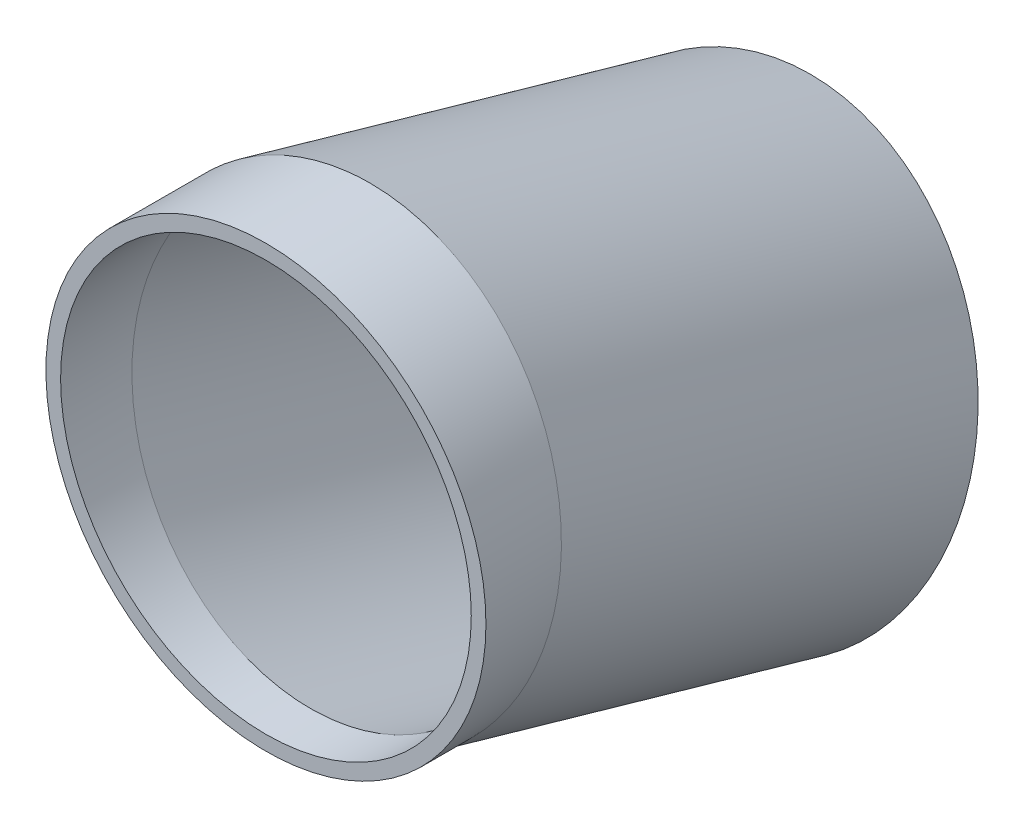
ISO-10303-21;
HEADER;
FILE_DESCRIPTION(('STEP AP214'),'2;1');
FILE_NAME('part.step','',(''),(''),'','','');
FILE_SCHEMA(('AUTOMOTIVE_DESIGN { 1 0 10303 214 1 1 1 1 }'));
ENDSEC;
DATA;
#1=APPLICATION_CONTEXT('core data for automotive mechanical design processes');
#2=APPLICATION_PROTOCOL_DEFINITION('international standard','automotive_design',2000,#1);
#3=PRODUCT_CONTEXT('',#1,'mechanical');
#4=PRODUCT('Part','Part','',(#3));
#5=PRODUCT_RELATED_PRODUCT_CATEGORY('part','',(#4));
#6=PRODUCT_DEFINITION_FORMATION('','',#4);
#7=PRODUCT_DEFINITION_CONTEXT('part definition',#1,'design');
#8=PRODUCT_DEFINITION('design','',#6,#7);
#9=PRODUCT_DEFINITION_SHAPE('','',#8);
#10=(LENGTH_UNIT() NAMED_UNIT(*) SI_UNIT(.MILLI.,.METRE.));
#11=(NAMED_UNIT(*) PLANE_ANGLE_UNIT() SI_UNIT($,.RADIAN.));
#12=(NAMED_UNIT(*) SI_UNIT($,.STERADIAN.) SOLID_ANGLE_UNIT());
#13=UNCERTAINTY_MEASURE_WITH_UNIT(LENGTH_MEASURE(1.E-05),#10,'distance_accuracy_value','');
#14=(GEOMETRIC_REPRESENTATION_CONTEXT(3) GLOBAL_UNCERTAINTY_ASSIGNED_CONTEXT((#13)) GLOBAL_UNIT_ASSIGNED_CONTEXT((#10,
#11,#12)) REPRESENTATION_CONTEXT('',''));
#15=CARTESIAN_POINT('',(0.,0.,0.));
#16=DIRECTION('',(0.,0.,1.));
#17=DIRECTION('',(1.,0.,0.));
#18=AXIS2_PLACEMENT_3D('',#15,#16,#17);
#19=CARTESIAN_POINT('',(0.,6.37602075205391,-2.68392736781131));
#20=DIRECTION('',(0.,-0.274721127897378,-0.961523947640823));
#21=DIRECTION('',(0.,0.961523947640823,-0.274721127897378));
#22=AXIS2_PLACEMENT_3D('',#19,#20,#21);
#23=CYLINDRICAL_SURFACE('',#22,75.);
#24=CARTESIAN_POINT('',(0.,0.,-25.));
#25=DIRECTION('',(0.,-0.138701211889401,-0.990334273778511));
#26=DIRECTION('',(0.,0.990334273778511,-0.138701211889401));
#27=AXIS2_PLACEMENT_3D('',#24,#25,#26);
#28=ELLIPSE('',#27,75.7320048248414,75.);
#29=CARTESIAN_POINT('',(0.,75.,-35.5041208480194));
#30=VERTEX_POINT('',#29);
#31=EDGE_CURVE('E39',#30,#30,#28,.T.);
#32=ORIENTED_EDGE('',*,*,#31,.T.);
#33=EDGE_LOOP('',(#32));
#34=FACE_BOUND('',#33,.T.);
#35=CARTESIAN_POINT('',(0.,-40.,-165.));
#36=DIRECTION('',(0.,0.274721127897378,0.961523947640823));
#37=DIRECTION('',(1.,0.,0.));
#38=AXIS2_PLACEMENT_3D('',#35,#36,#37);
#39=CIRCLE('',#38,75.);
#40=CARTESIAN_POINT('',(75.,-40.,-165.));
#41=VERTEX_POINT('',#40);
#42=EDGE_CURVE('E50',#41,#41,#39,.T.);
#43=ORIENTED_EDGE('',*,*,#42,.T.);
#44=EDGE_LOOP('',(#43));
#45=FACE_BOUND('',#44,.T.);
#46=ADVANCED_FACE('F36',(#34,#45),#23,.T.);
#47=CARTESIAN_POINT('',(0.,0.,0.));
#48=DIRECTION('',(0.,0.,-1.));
#49=DIRECTION('',(-1.,0.,0.));
#50=AXIS2_PLACEMENT_3D('',#47,#48,#49);
#51=CYLINDRICAL_SURFACE('',#50,75.);
#52=CARTESIAN_POINT('',(0.,0.,0.));
#53=DIRECTION('',(0.,0.,1.));
#54=DIRECTION('',(1.,0.,0.));
#55=AXIS2_PLACEMENT_3D('',#52,#53,#54);
#56=CIRCLE('',#55,75.);
#57=CARTESIAN_POINT('',(75.,0.,0.));
#58=VERTEX_POINT('',#57);
#59=EDGE_CURVE('E56',#58,#58,#56,.T.);
#60=ORIENTED_EDGE('',*,*,#59,.F.);
#61=EDGE_LOOP('',(#60));
#62=FACE_BOUND('',#61,.T.);
#63=ORIENTED_EDGE('',*,*,#31,.F.);
#64=EDGE_LOOP('',(#63));
#65=FACE_BOUND('',#64,.T.);
#66=ADVANCED_FACE('F81',(#62,#65),#51,.T.);
#67=CARTESIAN_POINT('',(0.,-40.,-165.));
#68=DIRECTION('',(0.,0.274721127897378,0.961523947640823));
#69=DIRECTION('',(1.,0.,0.));
#70=AXIS2_PLACEMENT_3D('',#67,#68,#69);
#71=PLANE('',#70);
#72=CARTESIAN_POINT('',(0.,-40.,-165.));
#73=DIRECTION('',(0.,0.274721127897378,0.961523947640823));
#74=DIRECTION('',(1.,0.,0.));
#75=AXIS2_PLACEMENT_3D('',#72,#73,#74);
#76=CIRCLE('',#75,70.);
#77=CARTESIAN_POINT('',(70.,-40.,-165.));
#78=VERTEX_POINT('',#77);
#79=EDGE_CURVE('E74',#78,#78,#76,.F.);
#80=ORIENTED_EDGE('',*,*,#79,.F.);
#81=EDGE_LOOP('',(#80));
#82=FACE_BOUND('',#81,.T.);
#83=ORIENTED_EDGE('',*,*,#42,.F.);
#84=EDGE_LOOP('',(#83));
#85=FACE_BOUND('',#84,.T.);
#86=ADVANCED_FACE('F85',(#82,#85),#71,.F.);
#87=CARTESIAN_POINT('',(0.,0.,0.));
#88=DIRECTION('',(0.,0.,1.));
#89=DIRECTION('',(1.,0.,0.));
#90=AXIS2_PLACEMENT_3D('',#87,#88,#89);
#91=PLANE('',#90);
#92=CARTESIAN_POINT('',(0.,0.,0.));
#93=DIRECTION('',(0.,0.,1.));
#94=DIRECTION('',(1.,0.,0.));
#95=AXIS2_PLACEMENT_3D('',#92,#93,#94);
#96=CIRCLE('',#95,70.);
#97=CARTESIAN_POINT('',(70.,0.,0.));
#98=VERTEX_POINT('',#97);
#99=EDGE_CURVE('E44',#98,#98,#96,.F.);
#100=ORIENTED_EDGE('',*,*,#99,.T.);
#101=EDGE_LOOP('',(#100));
#102=FACE_BOUND('',#101,.T.);
#103=ORIENTED_EDGE('',*,*,#59,.T.);
#104=EDGE_LOOP('',(#103));
#105=FACE_BOUND('',#104,.T.);
#106=ADVANCED_FACE('F93',(#102,#105),#91,.T.);
#107=CARTESIAN_POINT('',(0.,5.95278417610297,-4.16525538363961));
#108=DIRECTION('',(0.,-0.274721127897378,-0.961523947640823));
#109=DIRECTION('',(0.,0.961523947640823,-0.274721127897378));
#110=AXIS2_PLACEMENT_3D('',#107,#108,#109);
#111=CYLINDRICAL_SURFACE('',#110,70.);
#112=CARTESIAN_POINT('',(0.,0.,-25.));
#113=DIRECTION('',(0.,-0.138701211889401,-0.990334273778511));
#114=DIRECTION('',(0.,0.990334273778511,-0.138701211889401));
#115=AXIS2_PLACEMENT_3D('',#112,#113,#114);
#116=ELLIPSE('',#115,70.6832045031853,70.);
#117=CARTESIAN_POINT('',(0.,70.,-34.8038461248182));
#118=VERTEX_POINT('',#117);
#119=EDGE_CURVE('E11',#118,#118,#116,.F.);
#120=ORIENTED_EDGE('',*,*,#119,.T.);
#121=EDGE_LOOP('',(#120));
#122=FACE_BOUND('',#121,.T.);
#123=ORIENTED_EDGE('',*,*,#79,.T.);
#124=EDGE_LOOP('',(#123));
#125=FACE_BOUND('',#124,.T.);
#126=ADVANCED_FACE('F88',(#122,#125),#111,.F.);
#127=CARTESIAN_POINT('',(0.,0.,0.));
#128=DIRECTION('',(0.,0.,-1.));
#129=DIRECTION('',(-1.,0.,0.));
#130=AXIS2_PLACEMENT_3D('',#127,#128,#129);
#131=CYLINDRICAL_SURFACE('',#130,70.);
#132=ORIENTED_EDGE('',*,*,#99,.F.);
#133=EDGE_LOOP('',(#132));
#134=FACE_BOUND('',#133,.T.);
#135=ORIENTED_EDGE('',*,*,#119,.F.);
#136=EDGE_LOOP('',(#135));
#137=FACE_BOUND('',#136,.T.);
#138=ADVANCED_FACE('F72',(#134,#137),#131,.F.);
#139=CLOSED_SHELL('',(#46,#66,#86,#106,#126,#138));
#140=MANIFOLD_SOLID_BREP('B2',#139);
#141=ADVANCED_BREP_SHAPE_REPRESENTATION('',(#18,#140),#14);
#142=SHAPE_DEFINITION_REPRESENTATION(#9,#141);
ENDSEC;
END-ISO-10303-21;
